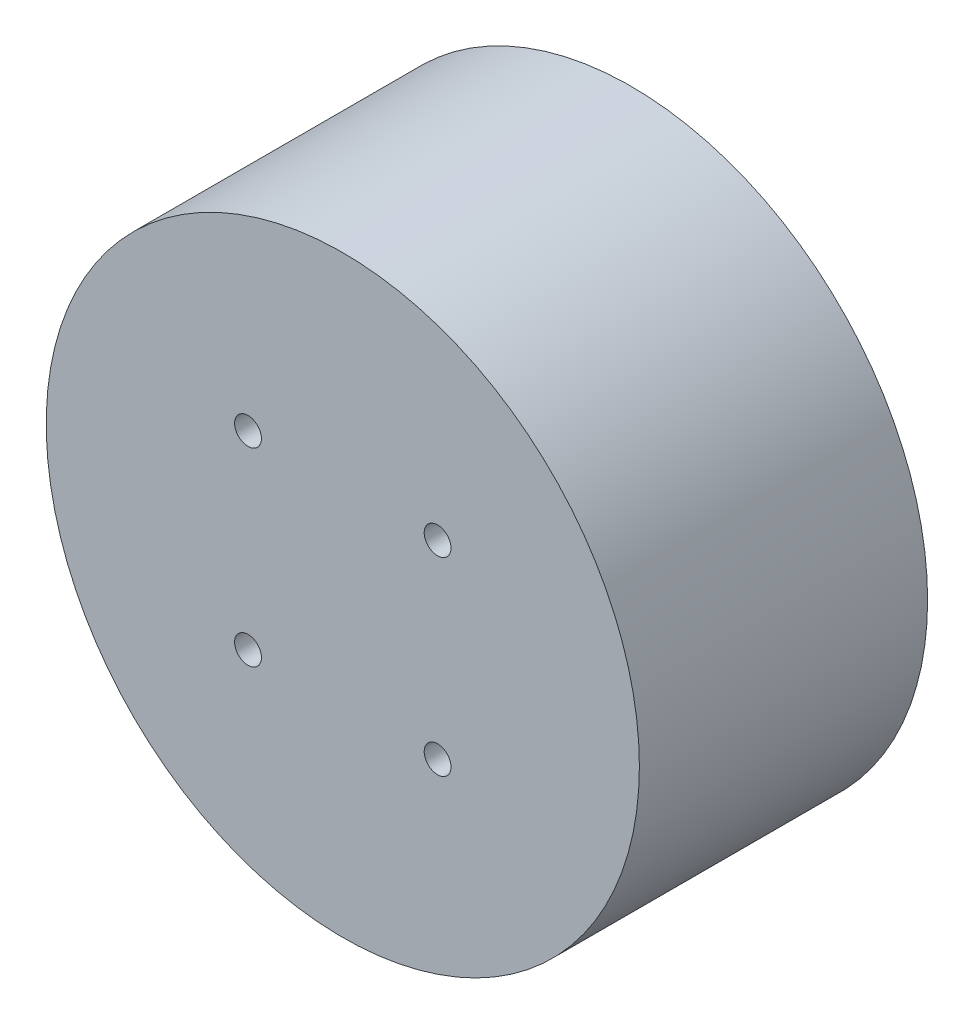
ISO-10303-21;
HEADER;
FILE_DESCRIPTION(('STEP AP214'),'2;1');
FILE_NAME('part.step','',(''),(''),'','','');
FILE_SCHEMA(('AUTOMOTIVE_DESIGN { 1 0 10303 214 1 1 1 1 }'));
ENDSEC;
DATA;
#1=APPLICATION_CONTEXT('core data for automotive mechanical design processes');
#2=APPLICATION_PROTOCOL_DEFINITION('international standard','automotive_design',2000,#1);
#3=PRODUCT_CONTEXT('',#1,'mechanical');
#4=PRODUCT('Part','Part','',(#3));
#5=PRODUCT_RELATED_PRODUCT_CATEGORY('part','',(#4));
#6=PRODUCT_DEFINITION_FORMATION('','',#4);
#7=PRODUCT_DEFINITION_CONTEXT('part definition',#1,'design');
#8=PRODUCT_DEFINITION('design','',#6,#7);
#9=PRODUCT_DEFINITION_SHAPE('','',#8);
#10=(LENGTH_UNIT() NAMED_UNIT(*) SI_UNIT(.MILLI.,.METRE.));
#11=(NAMED_UNIT(*) PLANE_ANGLE_UNIT() SI_UNIT($,.RADIAN.));
#12=(NAMED_UNIT(*) SI_UNIT($,.STERADIAN.) SOLID_ANGLE_UNIT());
#13=UNCERTAINTY_MEASURE_WITH_UNIT(LENGTH_MEASURE(1.E-05),#10,'distance_accuracy_value','');
#14=(GEOMETRIC_REPRESENTATION_CONTEXT(3) GLOBAL_UNCERTAINTY_ASSIGNED_CONTEXT((#13)) GLOBAL_UNIT_ASSIGNED_CONTEXT((#10,
#11,#12)) REPRESENTATION_CONTEXT('',''));
#15=CARTESIAN_POINT('',(0.,0.,0.));
#16=DIRECTION('',(0.,0.,1.));
#17=DIRECTION('',(1.,0.,0.));
#18=AXIS2_PLACEMENT_3D('',#15,#16,#17);
#19=CARTESIAN_POINT('',(0.,0.,43.));
#20=DIRECTION('',(0.,0.,-1.));
#21=DIRECTION('',(-1.,0.,0.));
#22=AXIS2_PLACEMENT_3D('',#19,#20,#21);
#23=CYLINDRICAL_SURFACE('',#22,44.25);
#24=CARTESIAN_POINT('',(0.,0.,43.));
#25=DIRECTION('',(0.,0.,1.));
#26=DIRECTION('',(1.,0.,0.));
#27=AXIS2_PLACEMENT_3D('',#24,#25,#26);
#28=CIRCLE('',#27,44.25);
#29=CARTESIAN_POINT('',(44.25,0.,43.));
#30=VERTEX_POINT('',#29);
#31=EDGE_CURVE('E10',#30,#30,#28,.T.);
#32=ORIENTED_EDGE('',*,*,#31,.F.);
#33=EDGE_LOOP('',(#32));
#34=FACE_BOUND('',#33,.T.);
#35=CARTESIAN_POINT('',(0.,0.,0.));
#36=DIRECTION('',(0.,0.,1.));
#37=DIRECTION('',(1.,0.,0.));
#38=AXIS2_PLACEMENT_3D('',#35,#36,#37);
#39=CIRCLE('',#38,44.25);
#40=CARTESIAN_POINT('',(44.25,0.,0.));
#41=VERTEX_POINT('',#40);
#42=EDGE_CURVE('E44',#41,#41,#39,.T.);
#43=ORIENTED_EDGE('',*,*,#42,.T.);
#44=EDGE_LOOP('',(#43));
#45=FACE_BOUND('',#44,.T.);
#46=ADVANCED_FACE('F41',(#34,#45),#23,.T.);
#47=CARTESIAN_POINT('',(0.,0.,43.));
#48=DIRECTION('',(0.,0.,1.));
#49=DIRECTION('',(1.,0.,0.));
#50=AXIS2_PLACEMENT_3D('',#47,#48,#49);
#51=PLANE('',#50);
#52=CARTESIAN_POINT('',(14.142135623731,14.1421356237309,43.));
#53=DIRECTION('',(0.,0.,1.));
#54=DIRECTION('',(1.,0.,0.));
#55=AXIS2_PLACEMENT_3D('',#52,#53,#54);
#56=CIRCLE('',#55,2.);
#57=CARTESIAN_POINT('',(16.142135623731,14.1421356237309,43.));
#58=VERTEX_POINT('',#57);
#59=EDGE_CURVE('E59',#58,#58,#56,.T.);
#60=ORIENTED_EDGE('',*,*,#59,.F.);
#61=EDGE_LOOP('',(#60));
#62=FACE_BOUND('',#61,.T.);
#63=CARTESIAN_POINT('',(-14.1421356237309,-14.142135623731,43.));
#64=DIRECTION('',(0.,0.,1.));
#65=DIRECTION('',(1.,0.,0.));
#66=AXIS2_PLACEMENT_3D('',#63,#64,#65);
#67=CIRCLE('',#66,2.);
#68=CARTESIAN_POINT('',(-12.1421356237309,-14.142135623731,43.));
#69=VERTEX_POINT('',#68);
#70=EDGE_CURVE('E67',#69,#69,#67,.T.);
#71=ORIENTED_EDGE('',*,*,#70,.F.);
#72=EDGE_LOOP('',(#71));
#73=FACE_BOUND('',#72,.T.);
#74=CARTESIAN_POINT('',(14.142135623731,-14.142135623731,43.));
#75=DIRECTION('',(0.,0.,1.));
#76=DIRECTION('',(1.,0.,0.));
#77=AXIS2_PLACEMENT_3D('',#74,#75,#76);
#78=CIRCLE('',#77,2.);
#79=CARTESIAN_POINT('',(16.142135623731,-14.142135623731,43.));
#80=VERTEX_POINT('',#79);
#81=EDGE_CURVE('E68',#80,#80,#78,.T.);
#82=ORIENTED_EDGE('',*,*,#81,.F.);
#83=EDGE_LOOP('',(#82));
#84=FACE_BOUND('',#83,.T.);
#85=CARTESIAN_POINT('',(-14.1421356237309,14.1421356237309,43.));
#86=DIRECTION('',(0.,0.,1.));
#87=DIRECTION('',(1.,0.,0.));
#88=AXIS2_PLACEMENT_3D('',#85,#86,#87);
#89=CIRCLE('',#88,2.);
#90=CARTESIAN_POINT('',(-12.1421356237309,14.1421356237309,43.));
#91=VERTEX_POINT('',#90);
#92=EDGE_CURVE('E55',#91,#91,#89,.T.);
#93=ORIENTED_EDGE('',*,*,#92,.F.);
#94=EDGE_LOOP('',(#93));
#95=FACE_BOUND('',#94,.T.);
#96=ORIENTED_EDGE('',*,*,#31,.T.);
#97=EDGE_LOOP('',(#96));
#98=FACE_BOUND('',#97,.T.);
#99=ADVANCED_FACE('F132',(#62,#73,#84,#95,#98),#51,.T.);
#100=CARTESIAN_POINT('',(0.,0.,0.));
#101=DIRECTION('',(0.,0.,1.));
#102=DIRECTION('',(1.,0.,0.));
#103=AXIS2_PLACEMENT_3D('',#100,#101,#102);
#104=PLANE('',#103);
#105=CARTESIAN_POINT('',(0.,15.5,0.));
#106=DIRECTION('',(0.,0.,-1.));
#107=DIRECTION('',(-1.,0.,0.));
#108=AXIS2_PLACEMENT_3D('',#105,#106,#107);
#109=CIRCLE('',#108,1.5);
#110=CARTESIAN_POINT('',(-1.5,15.5,0.));
#111=VERTEX_POINT('',#110);
#112=EDGE_CURVE('E111',#111,#111,#109,.T.);
#113=ORIENTED_EDGE('',*,*,#112,.F.);
#114=EDGE_LOOP('',(#113));
#115=FACE_BOUND('',#114,.T.);
#116=CARTESIAN_POINT('',(-15.5,0.,0.));
#117=DIRECTION('',(0.,0.,-1.));
#118=DIRECTION('',(-1.,0.,0.));
#119=AXIS2_PLACEMENT_3D('',#116,#117,#118);
#120=CIRCLE('',#119,1.5);
#121=CARTESIAN_POINT('',(-17.,0.,0.));
#122=VERTEX_POINT('',#121);
#123=EDGE_CURVE('E107',#122,#122,#120,.T.);
#124=ORIENTED_EDGE('',*,*,#123,.F.);
#125=EDGE_LOOP('',(#124));
#126=FACE_BOUND('',#125,.T.);
#127=CARTESIAN_POINT('',(15.5,0.,0.));
#128=DIRECTION('',(0.,0.,-1.));
#129=DIRECTION('',(-1.,0.,0.));
#130=AXIS2_PLACEMENT_3D('',#127,#128,#129);
#131=CIRCLE('',#130,1.5);
#132=CARTESIAN_POINT('',(14.,0.,0.));
#133=VERTEX_POINT('',#132);
#134=EDGE_CURVE('E99',#133,#133,#131,.T.);
#135=ORIENTED_EDGE('',*,*,#134,.F.);
#136=EDGE_LOOP('',(#135));
#137=FACE_BOUND('',#136,.T.);
#138=CARTESIAN_POINT('',(0.,-15.5,0.));
#139=DIRECTION('',(0.,0.,-1.));
#140=DIRECTION('',(-1.,0.,0.));
#141=AXIS2_PLACEMENT_3D('',#138,#139,#140);
#142=CIRCLE('',#141,1.5);
#143=CARTESIAN_POINT('',(-1.5,-15.5,0.));
#144=VERTEX_POINT('',#143);
#145=EDGE_CURVE('E91',#144,#144,#142,.T.);
#146=ORIENTED_EDGE('',*,*,#145,.F.);
#147=EDGE_LOOP('',(#146));
#148=FACE_BOUND('',#147,.T.);
#149=ORIENTED_EDGE('',*,*,#42,.F.);
#150=EDGE_LOOP('',(#149));
#151=FACE_BOUND('',#150,.T.);
#152=ADVANCED_FACE('F128',(#115,#126,#137,#148,#151),#104,.F.);
#153=CARTESIAN_POINT('',(-14.1421356237309,14.1421356237309,35.));
#154=DIRECTION('',(0.,0.,1.));
#155=DIRECTION('',(1.,0.,0.));
#156=AXIS2_PLACEMENT_3D('',#153,#154,#155);
#157=CYLINDRICAL_SURFACE('',#156,2.);
#158=CARTESIAN_POINT('',(-14.1421356237309,14.1421356237309,35.));
#159=DIRECTION('',(0.,0.,1.));
#160=DIRECTION('',(1.,0.,0.));
#161=AXIS2_PLACEMENT_3D('',#158,#159,#160);
#162=CIRCLE('',#161,2.);
#163=CARTESIAN_POINT('',(-12.1421356237309,14.1421356237309,35.));
#164=VERTEX_POINT('',#163);
#165=EDGE_CURVE('E53',#164,#164,#162,.T.);
#166=ORIENTED_EDGE('',*,*,#165,.F.);
#167=EDGE_LOOP('',(#166));
#168=FACE_BOUND('',#167,.T.);
#169=ORIENTED_EDGE('',*,*,#92,.T.);
#170=EDGE_LOOP('',(#169));
#171=FACE_BOUND('',#170,.T.);
#172=ADVANCED_FACE('F131',(#168,#171),#157,.F.);
#173=CARTESIAN_POINT('',(-14.1421356237309,14.1421356237309,35.));
#174=DIRECTION('',(0.,0.,1.));
#175=DIRECTION('',(1.,0.,0.));
#176=AXIS2_PLACEMENT_3D('',#173,#174,#175);
#177=PLANE('',#176);
#178=ORIENTED_EDGE('',*,*,#165,.T.);
#179=EDGE_LOOP('',(#178));
#180=FACE_BOUND('',#179,.T.);
#181=ADVANCED_FACE('F155',(#180),#177,.T.);
#182=CARTESIAN_POINT('',(14.142135623731,-14.142135623731,35.));
#183=DIRECTION('',(0.,0.,1.));
#184=DIRECTION('',(1.,0.,0.));
#185=AXIS2_PLACEMENT_3D('',#182,#183,#184);
#186=CYLINDRICAL_SURFACE('',#185,2.);
#187=CARTESIAN_POINT('',(14.142135623731,-14.142135623731,35.));
#188=DIRECTION('',(0.,0.,1.));
#189=DIRECTION('',(1.,0.,0.));
#190=AXIS2_PLACEMENT_3D('',#187,#188,#189);
#191=CIRCLE('',#190,2.);
#192=CARTESIAN_POINT('',(16.142135623731,-14.142135623731,35.));
#193=VERTEX_POINT('',#192);
#194=EDGE_CURVE('E79',#193,#193,#191,.T.);
#195=ORIENTED_EDGE('',*,*,#194,.F.);
#196=EDGE_LOOP('',(#195));
#197=FACE_BOUND('',#196,.T.);
#198=ORIENTED_EDGE('',*,*,#81,.T.);
#199=EDGE_LOOP('',(#198));
#200=FACE_BOUND('',#199,.T.);
#201=ADVANCED_FACE('F159',(#197,#200),#186,.F.);
#202=CARTESIAN_POINT('',(14.142135623731,-14.142135623731,35.));
#203=DIRECTION('',(0.,0.,1.));
#204=DIRECTION('',(1.,0.,0.));
#205=AXIS2_PLACEMENT_3D('',#202,#203,#204);
#206=PLANE('',#205);
#207=ORIENTED_EDGE('',*,*,#194,.T.);
#208=EDGE_LOOP('',(#207));
#209=FACE_BOUND('',#208,.T.);
#210=ADVANCED_FACE('F169',(#209),#206,.T.);
#211=CARTESIAN_POINT('',(-14.1421356237309,-14.142135623731,35.));
#212=DIRECTION('',(0.,0.,1.));
#213=DIRECTION('',(1.,0.,0.));
#214=AXIS2_PLACEMENT_3D('',#211,#212,#213);
#215=CYLINDRICAL_SURFACE('',#214,2.);
#216=CARTESIAN_POINT('',(-14.1421356237309,-14.142135623731,35.));
#217=DIRECTION('',(0.,0.,1.));
#218=DIRECTION('',(1.,0.,0.));
#219=AXIS2_PLACEMENT_3D('',#216,#217,#218);
#220=CIRCLE('',#219,2.);
#221=CARTESIAN_POINT('',(-12.1421356237309,-14.142135623731,35.));
#222=VERTEX_POINT('',#221);
#223=EDGE_CURVE('E63',#222,#222,#220,.T.);
#224=ORIENTED_EDGE('',*,*,#223,.F.);
#225=EDGE_LOOP('',(#224));
#226=FACE_BOUND('',#225,.T.);
#227=ORIENTED_EDGE('',*,*,#70,.T.);
#228=EDGE_LOOP('',(#227));
#229=FACE_BOUND('',#228,.T.);
#230=ADVANCED_FACE('F165',(#226,#229),#215,.F.);
#231=CARTESIAN_POINT('',(-14.1421356237309,-14.142135623731,35.));
#232=DIRECTION('',(0.,0.,1.));
#233=DIRECTION('',(1.,0.,0.));
#234=AXIS2_PLACEMENT_3D('',#231,#232,#233);
#235=PLANE('',#234);
#236=ORIENTED_EDGE('',*,*,#223,.T.);
#237=EDGE_LOOP('',(#236));
#238=FACE_BOUND('',#237,.T.);
#239=ADVANCED_FACE('F161',(#238),#235,.T.);
#240=CARTESIAN_POINT('',(14.142135623731,14.1421356237309,35.));
#241=DIRECTION('',(0.,0.,1.));
#242=DIRECTION('',(1.,0.,0.));
#243=AXIS2_PLACEMENT_3D('',#240,#241,#242);
#244=CYLINDRICAL_SURFACE('',#243,2.);
#245=CARTESIAN_POINT('',(14.142135623731,14.1421356237309,35.));
#246=DIRECTION('',(0.,0.,1.));
#247=DIRECTION('',(1.,0.,0.));
#248=AXIS2_PLACEMENT_3D('',#245,#246,#247);
#249=CIRCLE('',#248,2.);
#250=CARTESIAN_POINT('',(16.142135623731,14.1421356237309,35.));
#251=VERTEX_POINT('',#250);
#252=EDGE_CURVE('E72',#251,#251,#249,.T.);
#253=ORIENTED_EDGE('',*,*,#252,.F.);
#254=EDGE_LOOP('',(#253));
#255=FACE_BOUND('',#254,.T.);
#256=ORIENTED_EDGE('',*,*,#59,.T.);
#257=EDGE_LOOP('',(#256));
#258=FACE_BOUND('',#257,.T.);
#259=ADVANCED_FACE('F164',(#255,#258),#244,.F.);
#260=CARTESIAN_POINT('',(14.142135623731,14.1421356237309,35.));
#261=DIRECTION('',(0.,0.,1.));
#262=DIRECTION('',(1.,0.,0.));
#263=AXIS2_PLACEMENT_3D('',#260,#261,#262);
#264=PLANE('',#263);
#265=ORIENTED_EDGE('',*,*,#252,.T.);
#266=EDGE_LOOP('',(#265));
#267=FACE_BOUND('',#266,.T.);
#268=ADVANCED_FACE('F171',(#267),#264,.T.);
#269=CARTESIAN_POINT('',(0.,-15.5,20.));
#270=DIRECTION('',(0.,0.,-1.));
#271=DIRECTION('',(-1.,0.,0.));
#272=AXIS2_PLACEMENT_3D('',#269,#270,#271);
#273=CYLINDRICAL_SURFACE('',#272,1.5);
#274=CARTESIAN_POINT('',(0.,-15.5,20.));
#275=DIRECTION('',(0.,0.,-1.));
#276=DIRECTION('',(-1.,0.,0.));
#277=AXIS2_PLACEMENT_3D('',#274,#275,#276);
#278=CIRCLE('',#277,1.5);
#279=CARTESIAN_POINT('',(-1.5,-15.5,20.));
#280=VERTEX_POINT('',#279);
#281=EDGE_CURVE('E87',#280,#280,#278,.T.);
#282=ORIENTED_EDGE('',*,*,#281,.F.);
#283=EDGE_LOOP('',(#282));
#284=FACE_BOUND('',#283,.T.);
#285=ORIENTED_EDGE('',*,*,#145,.T.);
#286=EDGE_LOOP('',(#285));
#287=FACE_BOUND('',#286,.T.);
#288=ADVANCED_FACE('F174',(#284,#287),#273,.F.);
#289=CARTESIAN_POINT('',(0.,-15.5,20.));
#290=DIRECTION('',(0.,0.,-1.));
#291=DIRECTION('',(-1.,0.,0.));
#292=AXIS2_PLACEMENT_3D('',#289,#290,#291);
#293=PLANE('',#292);
#294=ORIENTED_EDGE('',*,*,#281,.T.);
#295=EDGE_LOOP('',(#294));
#296=FACE_BOUND('',#295,.T.);
#297=ADVANCED_FACE('F185',(#296),#293,.T.);
#298=CARTESIAN_POINT('',(15.5,0.,20.));
#299=DIRECTION('',(0.,0.,-1.));
#300=DIRECTION('',(-1.,0.,0.));
#301=AXIS2_PLACEMENT_3D('',#298,#299,#300);
#302=CYLINDRICAL_SURFACE('',#301,1.5);
#303=CARTESIAN_POINT('',(15.5,0.,20.));
#304=DIRECTION('',(0.,0.,-1.));
#305=DIRECTION('',(-1.,0.,0.));
#306=AXIS2_PLACEMENT_3D('',#303,#304,#305);
#307=CIRCLE('',#306,1.5);
#308=CARTESIAN_POINT('',(14.,0.,20.));
#309=VERTEX_POINT('',#308);
#310=EDGE_CURVE('E95',#309,#309,#307,.T.);
#311=ORIENTED_EDGE('',*,*,#310,.F.);
#312=EDGE_LOOP('',(#311));
#313=FACE_BOUND('',#312,.T.);
#314=ORIENTED_EDGE('',*,*,#134,.T.);
#315=EDGE_LOOP('',(#314));
#316=FACE_BOUND('',#315,.T.);
#317=ADVANCED_FACE('F188',(#313,#316),#302,.F.);
#318=CARTESIAN_POINT('',(15.5,0.,20.));
#319=DIRECTION('',(0.,0.,-1.));
#320=DIRECTION('',(-1.,0.,0.));
#321=AXIS2_PLACEMENT_3D('',#318,#319,#320);
#322=PLANE('',#321);
#323=ORIENTED_EDGE('',*,*,#310,.T.);
#324=EDGE_LOOP('',(#323));
#325=FACE_BOUND('',#324,.T.);
#326=ADVANCED_FACE('F193',(#325),#322,.T.);
#327=CARTESIAN_POINT('',(-15.5,0.,20.));
#328=DIRECTION('',(0.,0.,-1.));
#329=DIRECTION('',(-1.,0.,0.));
#330=AXIS2_PLACEMENT_3D('',#327,#328,#329);
#331=CYLINDRICAL_SURFACE('',#330,1.5);
#332=CARTESIAN_POINT('',(-15.5,0.,20.));
#333=DIRECTION('',(0.,0.,-1.));
#334=DIRECTION('',(-1.,0.,0.));
#335=AXIS2_PLACEMENT_3D('',#332,#333,#334);
#336=CIRCLE('',#335,1.5);
#337=CARTESIAN_POINT('',(-17.,0.,20.));
#338=VERTEX_POINT('',#337);
#339=EDGE_CURVE('E103',#338,#338,#336,.T.);
#340=ORIENTED_EDGE('',*,*,#339,.F.);
#341=EDGE_LOOP('',(#340));
#342=FACE_BOUND('',#341,.T.);
#343=ORIENTED_EDGE('',*,*,#123,.T.);
#344=EDGE_LOOP('',(#343));
#345=FACE_BOUND('',#344,.T.);
#346=ADVANCED_FACE('F196',(#342,#345),#331,.F.);
#347=CARTESIAN_POINT('',(-15.5,0.,20.));
#348=DIRECTION('',(0.,0.,-1.));
#349=DIRECTION('',(-1.,0.,0.));
#350=AXIS2_PLACEMENT_3D('',#347,#348,#349);
#351=PLANE('',#350);
#352=ORIENTED_EDGE('',*,*,#339,.T.);
#353=EDGE_LOOP('',(#352));
#354=FACE_BOUND('',#353,.T.);
#355=ADVANCED_FACE('F124',(#354),#351,.T.);
#356=CARTESIAN_POINT('',(0.,15.5,20.));
#357=DIRECTION('',(0.,0.,-1.));
#358=DIRECTION('',(-1.,0.,0.));
#359=AXIS2_PLACEMENT_3D('',#356,#357,#358);
#360=CYLINDRICAL_SURFACE('',#359,1.5);
#361=CARTESIAN_POINT('',(0.,15.5,20.));
#362=DIRECTION('',(0.,0.,-1.));
#363=DIRECTION('',(-1.,0.,0.));
#364=AXIS2_PLACEMENT_3D('',#361,#362,#363);
#365=CIRCLE('',#364,1.5);
#366=CARTESIAN_POINT('',(-1.5,15.5,20.));
#367=VERTEX_POINT('',#366);
#368=EDGE_CURVE('E83',#367,#367,#365,.T.);
#369=ORIENTED_EDGE('',*,*,#368,.F.);
#370=EDGE_LOOP('',(#369));
#371=FACE_BOUND('',#370,.T.);
#372=ORIENTED_EDGE('',*,*,#112,.T.);
#373=EDGE_LOOP('',(#372));
#374=FACE_BOUND('',#373,.T.);
#375=ADVANCED_FACE('F121',(#371,#374),#360,.F.);
#376=CARTESIAN_POINT('',(0.,15.5,20.));
#377=DIRECTION('',(0.,0.,-1.));
#378=DIRECTION('',(-1.,0.,0.));
#379=AXIS2_PLACEMENT_3D('',#376,#377,#378);
#380=PLANE('',#379);
#381=ORIENTED_EDGE('',*,*,#368,.T.);
#382=EDGE_LOOP('',(#381));
#383=FACE_BOUND('',#382,.T.);
#384=ADVANCED_FACE('F119',(#383),#380,.T.);
#385=CLOSED_SHELL('',(#46,#99,#152,#172,#181,#201,#210,#230,#239,#259,#268,#288,#297,#317,#326,
#346,#355,#375,#384));
#386=MANIFOLD_SOLID_BREP('B2',#385);
#387=ADVANCED_BREP_SHAPE_REPRESENTATION('',(#18,#386),#14);
#388=SHAPE_DEFINITION_REPRESENTATION(#9,#387);
ENDSEC;
END-ISO-10303-21;
